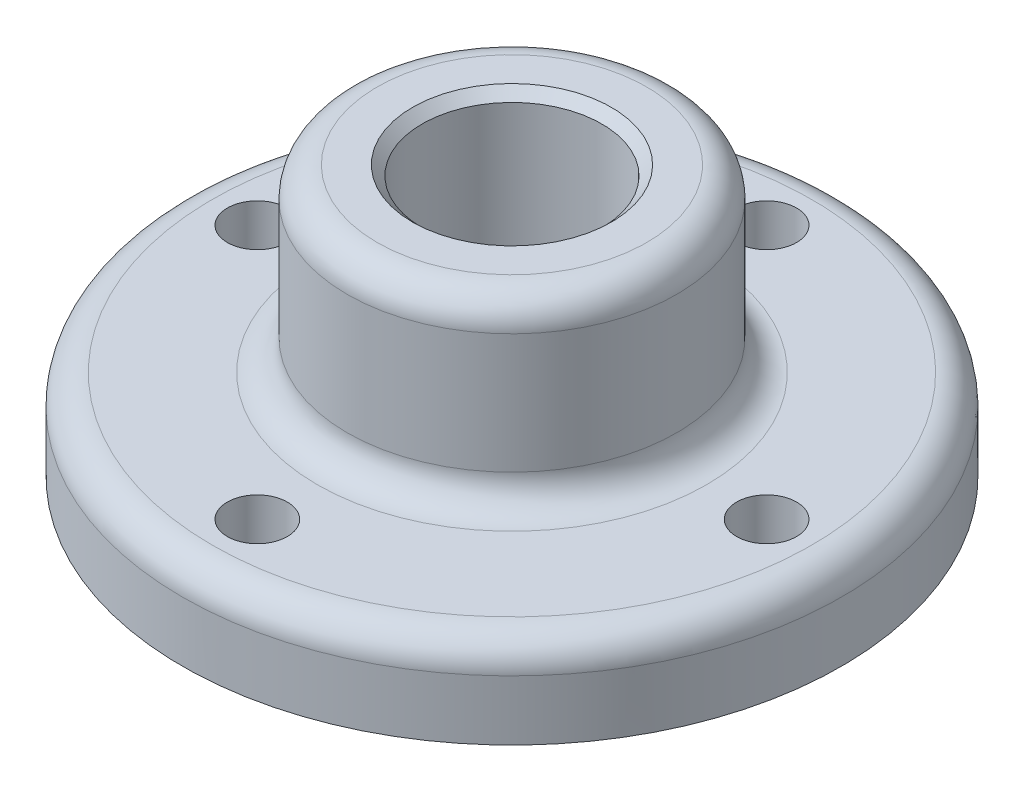
ISO-10303-21;
HEADER;
FILE_DESCRIPTION(('STEP AP214'),'2;1');
FILE_NAME('part.step','',(''),(''),'','','');
FILE_SCHEMA(('AUTOMOTIVE_DESIGN { 1 0 10303 214 1 1 1 1 }'));
ENDSEC;
DATA;
#1=APPLICATION_CONTEXT('core data for automotive mechanical design processes');
#2=APPLICATION_PROTOCOL_DEFINITION('international standard','automotive_design',2000,#1);
#3=PRODUCT_CONTEXT('',#1,'mechanical');
#4=PRODUCT('Part','Part','',(#3));
#5=PRODUCT_RELATED_PRODUCT_CATEGORY('part','',(#4));
#6=PRODUCT_DEFINITION_FORMATION('','',#4);
#7=PRODUCT_DEFINITION_CONTEXT('part definition',#1,'design');
#8=PRODUCT_DEFINITION('design','',#6,#7);
#9=PRODUCT_DEFINITION_SHAPE('','',#8);
#10=(LENGTH_UNIT() NAMED_UNIT(*) SI_UNIT(.MILLI.,.METRE.));
#11=(NAMED_UNIT(*) PLANE_ANGLE_UNIT() SI_UNIT($,.RADIAN.));
#12=(NAMED_UNIT(*) SI_UNIT($,.STERADIAN.) SOLID_ANGLE_UNIT());
#13=UNCERTAINTY_MEASURE_WITH_UNIT(LENGTH_MEASURE(1.E-05),#10,'distance_accuracy_value','');
#14=(GEOMETRIC_REPRESENTATION_CONTEXT(3) GLOBAL_UNCERTAINTY_ASSIGNED_CONTEXT((#13)) GLOBAL_UNIT_ASSIGNED_CONTEXT((#10,
#11,#12)) REPRESENTATION_CONTEXT('',''));
#15=CARTESIAN_POINT('',(0.,0.,0.));
#16=DIRECTION('',(0.,0.,1.));
#17=DIRECTION('',(1.,0.,0.));
#18=AXIS2_PLACEMENT_3D('',#15,#16,#17);
#19=CARTESIAN_POINT('',(0.,0.,0.));
#20=DIRECTION('',(0.,-1.,0.));
#21=DIRECTION('',(0.,0.,-1.));
#22=AXIS2_PLACEMENT_3D('',#19,#20,#21);
#23=PLANE('',#22);
#24=CARTESIAN_POINT('',(-53.9749999999985,0.,1.53406209396152E-12));
#25=DIRECTION('',(0.,-1.,0.));
#26=DIRECTION('',(0.,0.,-1.));
#27=AXIS2_PLACEMENT_3D('',#24,#25,#26);
#28=CIRCLE('',#27,6.35000000000245);
#29=CARTESIAN_POINT('',(-53.9749999999985,0.,6.35000000000399));
#30=VERTEX_POINT('',#29);
#31=EDGE_CURVE('E87',#30,#30,#28,.F.);
#32=ORIENTED_EDGE('',*,*,#31,.T.);
#33=EDGE_LOOP('',(#32));
#34=FACE_BOUND('',#33,.T.);
#35=CARTESIAN_POINT('',(3.05490412572624E-12,0.,53.975));
#36=DIRECTION('',(0.,-1.,0.));
#37=DIRECTION('',(0.,0.,-1.));
#38=AXIS2_PLACEMENT_3D('',#35,#36,#37);
#39=CIRCLE('',#38,6.35000000000328);
#40=CARTESIAN_POINT('',(3.05490412572624E-12,0.,60.3250000000033));
#41=VERTEX_POINT('',#40);
#42=EDGE_CURVE('E81',#41,#41,#39,.F.);
#43=ORIENTED_EDGE('',*,*,#42,.T.);
#44=EDGE_LOOP('',(#43));
#45=FACE_BOUND('',#44,.T.);
#46=CARTESIAN_POINT('',(53.9750000000015,0.,-1.52745206286312E-12));
#47=DIRECTION('',(0.,-1.,0.));
#48=DIRECTION('',(0.,0.,-1.));
#49=AXIS2_PLACEMENT_3D('',#46,#47,#48);
#50=CIRCLE('',#49,6.3500000000012);
#51=CARTESIAN_POINT('',(53.9750000000015,0.,6.34999999999967));
#52=VERTEX_POINT('',#51);
#53=EDGE_CURVE('E75',#52,#52,#50,.F.);
#54=ORIENTED_EDGE('',*,*,#53,.T.);
#55=EDGE_LOOP('',(#54));
#56=FACE_BOUND('',#55,.T.);
#57=CARTESIAN_POINT('',(0.,0.,-53.975));
#58=DIRECTION('',(0.,-1.,0.));
#59=DIRECTION('',(0.,0.,-1.));
#60=AXIS2_PLACEMENT_3D('',#57,#58,#59);
#61=CIRCLE('',#60,6.35);
#62=CARTESIAN_POINT('',(0.,0.,-47.625));
#63=VERTEX_POINT('',#62);
#64=EDGE_CURVE('E69',#63,#63,#61,.F.);
#65=ORIENTED_EDGE('',*,*,#64,.T.);
#66=EDGE_LOOP('',(#65));
#67=FACE_BOUND('',#66,.T.);
#68=CARTESIAN_POINT('',(0.,0.,0.));
#69=DIRECTION('',(0.,1.,0.));
#70=DIRECTION('',(0.,0.,1.));
#71=AXIS2_PLACEMENT_3D('',#68,#69,#70);
#72=CIRCLE('',#71,19.05);
#73=CARTESIAN_POINT('',(0.,0.,19.05));
#74=VERTEX_POINT('',#73);
#75=EDGE_CURVE('E66',#74,#74,#72,.T.);
#76=ORIENTED_EDGE('',*,*,#75,.T.);
#77=EDGE_LOOP('',(#76));
#78=FACE_BOUND('',#77,.T.);
#79=CARTESIAN_POINT('',(0.,0.,0.));
#80=DIRECTION('',(0.,-1.,0.));
#81=DIRECTION('',(0.,0.,-1.));
#82=AXIS2_PLACEMENT_3D('',#79,#80,#81);
#83=CIRCLE('',#82,69.85);
#84=CARTESIAN_POINT('',(0.,0.,-69.85));
#85=VERTEX_POINT('',#84);
#86=EDGE_CURVE('E63',#85,#85,#83,.T.);
#87=ORIENTED_EDGE('',*,*,#86,.T.);
#88=EDGE_LOOP('',(#87));
#89=FACE_BOUND('',#88,.T.);
#90=ADVANCED_FACE('F31',(#34,#45,#56,#67,#78,#89),#23,.T.);
#91=CARTESIAN_POINT('',(0.,0.,0.));
#92=DIRECTION('',(0.,-1.,0.));
#93=DIRECTION('',(0.,0.,-1.));
#94=AXIS2_PLACEMENT_3D('',#91,#92,#93);
#95=CYLINDRICAL_SURFACE('',#94,69.85);
#96=CARTESIAN_POINT('',(0.,12.7,0.));
#97=DIRECTION('',(0.,1.,0.));
#98=DIRECTION('',(0.,0.,1.));
#99=AXIS2_PLACEMENT_3D('',#96,#97,#98);
#100=CIRCLE('',#99,69.85);
#101=CARTESIAN_POINT('',(0.,12.7,69.85));
#102=VERTEX_POINT('',#101);
#103=EDGE_CURVE('E60',#102,#102,#100,.F.);
#104=ORIENTED_EDGE('',*,*,#103,.T.);
#105=EDGE_LOOP('',(#104));
#106=FACE_BOUND('',#105,.T.);
#107=ORIENTED_EDGE('',*,*,#86,.F.);
#108=EDGE_LOOP('',(#107));
#109=FACE_BOUND('',#108,.T.);
#110=ADVANCED_FACE('F101',(#106,#109),#95,.T.);
#111=CARTESIAN_POINT('',(69.85,19.05,0.));
#112=DIRECTION('',(0.,1.,0.));
#113=DIRECTION('',(0.,0.,1.));
#114=AXIS2_PLACEMENT_3D('',#111,#112,#113);
#115=PLANE('',#114);
#116=CARTESIAN_POINT('',(0.,19.05,0.));
#117=DIRECTION('',(0.,1.,0.));
#118=DIRECTION('',(0.,0.,1.));
#119=AXIS2_PLACEMENT_3D('',#116,#117,#118);
#120=CIRCLE('',#119,63.5);
#121=CARTESIAN_POINT('',(0.,19.05,63.5));
#122=VERTEX_POINT('',#121);
#123=EDGE_CURVE('E54',#122,#122,#120,.T.);
#124=ORIENTED_EDGE('',*,*,#123,.T.);
#125=EDGE_LOOP('',(#124));
#126=FACE_BOUND('',#125,.T.);
#127=CARTESIAN_POINT('',(0.,19.05,0.));
#128=DIRECTION('',(0.,1.,0.));
#129=DIRECTION('',(0.,0.,1.));
#130=AXIS2_PLACEMENT_3D('',#127,#128,#129);
#131=CIRCLE('',#130,41.275);
#132=CARTESIAN_POINT('',(0.,19.05,41.275));
#133=VERTEX_POINT('',#132);
#134=EDGE_CURVE('E57',#133,#133,#131,.F.);
#135=ORIENTED_EDGE('',*,*,#134,.T.);
#136=EDGE_LOOP('',(#135));
#137=FACE_BOUND('',#136,.T.);
#138=CARTESIAN_POINT('',(-53.9749999999985,19.05,1.53406209396152E-12));
#139=DIRECTION('',(0.,1.,0.));
#140=DIRECTION('',(0.,0.,1.));
#141=AXIS2_PLACEMENT_3D('',#138,#139,#140);
#142=CIRCLE('',#141,6.35000000000245);
#143=CARTESIAN_POINT('',(-53.9749999999985,19.05,6.35000000000399));
#144=VERTEX_POINT('',#143);
#145=EDGE_CURVE('E90',#144,#144,#142,.T.);
#146=ORIENTED_EDGE('',*,*,#145,.F.);
#147=EDGE_LOOP('',(#146));
#148=FACE_BOUND('',#147,.T.);
#149=CARTESIAN_POINT('',(3.05490412572624E-12,19.05,53.975));
#150=DIRECTION('',(0.,1.,0.));
#151=DIRECTION('',(0.,0.,1.));
#152=AXIS2_PLACEMENT_3D('',#149,#150,#151);
#153=CIRCLE('',#152,6.35000000000328);
#154=CARTESIAN_POINT('',(3.05490412572624E-12,19.05,60.3250000000033));
#155=VERTEX_POINT('',#154);
#156=EDGE_CURVE('E84',#155,#155,#153,.T.);
#157=ORIENTED_EDGE('',*,*,#156,.F.);
#158=EDGE_LOOP('',(#157));
#159=FACE_BOUND('',#158,.T.);
#160=CARTESIAN_POINT('',(53.9750000000015,19.05,-1.52745206286312E-12));
#161=DIRECTION('',(0.,1.,0.));
#162=DIRECTION('',(0.,0.,1.));
#163=AXIS2_PLACEMENT_3D('',#160,#161,#162);
#164=CIRCLE('',#163,6.3500000000012);
#165=CARTESIAN_POINT('',(53.9750000000015,19.05,6.34999999999967));
#166=VERTEX_POINT('',#165);
#167=EDGE_CURVE('E78',#166,#166,#164,.T.);
#168=ORIENTED_EDGE('',*,*,#167,.F.);
#169=EDGE_LOOP('',(#168));
#170=FACE_BOUND('',#169,.T.);
#171=CARTESIAN_POINT('',(0.,19.05,-53.975));
#172=DIRECTION('',(0.,1.,0.));
#173=DIRECTION('',(0.,0.,1.));
#174=AXIS2_PLACEMENT_3D('',#171,#172,#173);
#175=CIRCLE('',#174,6.35);
#176=CARTESIAN_POINT('',(0.,19.05,-47.625));
#177=VERTEX_POINT('',#176);
#178=EDGE_CURVE('E72',#177,#177,#175,.T.);
#179=ORIENTED_EDGE('',*,*,#178,.F.);
#180=EDGE_LOOP('',(#179));
#181=FACE_BOUND('',#180,.T.);
#182=ADVANCED_FACE('F97',(#126,#137,#148,#159,#170,#181),#115,.T.);
#183=CARTESIAN_POINT('',(0.,0.,0.));
#184=DIRECTION('',(0.,-1.,0.));
#185=DIRECTION('',(0.,0.,-1.));
#186=AXIS2_PLACEMENT_3D('',#183,#184,#185);
#187=CYLINDRICAL_SURFACE('',#186,34.925);
#188=CARTESIAN_POINT('',(0.,50.8,0.));
#189=DIRECTION('',(0.,1.,0.));
#190=DIRECTION('',(0.,0.,1.));
#191=AXIS2_PLACEMENT_3D('',#188,#189,#190);
#192=CIRCLE('',#191,34.925);
#193=CARTESIAN_POINT('',(0.,50.8,34.925));
#194=VERTEX_POINT('',#193);
#195=EDGE_CURVE('E46',#194,#194,#192,.F.);
#196=ORIENTED_EDGE('',*,*,#195,.T.);
#197=EDGE_LOOP('',(#196));
#198=FACE_BOUND('',#197,.T.);
#199=CARTESIAN_POINT('',(0.,25.4,0.));
#200=DIRECTION('',(0.,1.,0.));
#201=DIRECTION('',(0.,0.,1.));
#202=AXIS2_PLACEMENT_3D('',#199,#200,#201);
#203=CIRCLE('',#202,34.925);
#204=CARTESIAN_POINT('',(0.,25.4,34.925));
#205=VERTEX_POINT('',#204);
#206=EDGE_CURVE('E51',#205,#205,#203,.T.);
#207=ORIENTED_EDGE('',*,*,#206,.T.);
#208=EDGE_LOOP('',(#207));
#209=FACE_BOUND('',#208,.T.);
#210=ADVANCED_FACE('F100',(#198,#209),#187,.T.);
#211=CARTESIAN_POINT('',(34.925,57.15,0.));
#212=DIRECTION('',(0.,1.,0.));
#213=DIRECTION('',(0.,0.,1.));
#214=AXIS2_PLACEMENT_3D('',#211,#212,#213);
#215=PLANE('',#214);
#216=CARTESIAN_POINT('',(0.,57.15,0.));
#217=DIRECTION('',(0.,1.,0.));
#218=DIRECTION('',(0.,0.,1.));
#219=AXIS2_PLACEMENT_3D('',#216,#217,#218);
#220=CIRCLE('',#219,21.082);
#221=CARTESIAN_POINT('',(0.,57.15,21.082));
#222=VERTEX_POINT('',#221);
#223=EDGE_CURVE('E10',#222,#222,#220,.F.);
#224=ORIENTED_EDGE('',*,*,#223,.T.);
#225=EDGE_LOOP('',(#224));
#226=FACE_BOUND('',#225,.T.);
#227=CARTESIAN_POINT('',(0.,57.15,0.));
#228=DIRECTION('',(0.,1.,0.));
#229=DIRECTION('',(0.,0.,1.));
#230=AXIS2_PLACEMENT_3D('',#227,#228,#229);
#231=CIRCLE('',#230,28.575);
#232=CARTESIAN_POINT('',(0.,57.15,28.575));
#233=VERTEX_POINT('',#232);
#234=EDGE_CURVE('E42',#233,#233,#231,.T.);
#235=ORIENTED_EDGE('',*,*,#234,.T.);
#236=EDGE_LOOP('',(#235));
#237=FACE_BOUND('',#236,.T.);
#238=ADVANCED_FACE('F153',(#226,#237),#215,.T.);
#239=CARTESIAN_POINT('',(0.,0.,0.));
#240=DIRECTION('',(0.,1.,0.));
#241=DIRECTION('',(0.,0.,1.));
#242=AXIS2_PLACEMENT_3D('',#239,#240,#241);
#243=CYLINDRICAL_SURFACE('',#242,19.05);
#244=CARTESIAN_POINT('',(0.,55.118,0.));
#245=DIRECTION('',(0.,1.,0.));
#246=DIRECTION('',(0.,0.,1.));
#247=AXIS2_PLACEMENT_3D('',#244,#245,#246);
#248=CIRCLE('',#247,19.05);
#249=CARTESIAN_POINT('',(0.,55.118,19.05));
#250=VERTEX_POINT('',#249);
#251=EDGE_CURVE('E38',#250,#250,#248,.T.);
#252=ORIENTED_EDGE('',*,*,#251,.T.);
#253=EDGE_LOOP('',(#252));
#254=FACE_BOUND('',#253,.T.);
#255=ORIENTED_EDGE('',*,*,#75,.F.);
#256=EDGE_LOOP('',(#255));
#257=FACE_BOUND('',#256,.T.);
#258=ADVANCED_FACE('F114',(#254,#257),#243,.F.);
#259=CARTESIAN_POINT('',(0.,-17.9605122421476,-53.975));
#260=DIRECTION('',(0.,1.,0.));
#261=DIRECTION('',(0.,0.,1.));
#262=AXIS2_PLACEMENT_3D('',#259,#260,#261);
#263=CYLINDRICAL_SURFACE('',#262,6.35);
#264=CARTESIAN_POINT('',(0.,19.05,-47.625));
#265=CARTESIAN_POINT('',(0.,18.8515625,-47.625));
#266=CARTESIAN_POINT('',(0.,18.653125,-47.625));
#267=CARTESIAN_POINT('',(0.,18.25625,-47.625));
#268=CARTESIAN_POINT('',(0.,18.0578125,-47.625));
#269=CARTESIAN_POINT('',(0.,17.6609375,-47.625));
#270=CARTESIAN_POINT('',(0.,17.4625,-47.625));
#271=CARTESIAN_POINT('',(0.,17.065625,-47.625));
#272=CARTESIAN_POINT('',(0.,16.8671875,-47.625));
#273=CARTESIAN_POINT('',(0.,16.4703125,-47.625));
#274=CARTESIAN_POINT('',(0.,16.271875,-47.625));
#275=CARTESIAN_POINT('',(0.,15.875,-47.625));
#276=CARTESIAN_POINT('',(0.,15.6765625,-47.625));
#277=CARTESIAN_POINT('',(0.,15.2796875,-47.625));
#278=CARTESIAN_POINT('',(0.,15.08125,-47.625));
#279=CARTESIAN_POINT('',(0.,14.684375,-47.625));
#280=CARTESIAN_POINT('',(0.,14.4859375,-47.625));
#281=CARTESIAN_POINT('',(0.,14.0890625,-47.625));
#282=CARTESIAN_POINT('',(0.,13.890625,-47.625));
#283=CARTESIAN_POINT('',(0.,13.49375,-47.625));
#284=CARTESIAN_POINT('',(0.,13.2953125,-47.625));
#285=CARTESIAN_POINT('',(0.,12.8984375,-47.625));
#286=CARTESIAN_POINT('',(0.,12.7,-47.625));
#287=CARTESIAN_POINT('',(0.,12.303125,-47.625));
#288=CARTESIAN_POINT('',(0.,12.1046875,-47.625));
#289=CARTESIAN_POINT('',(0.,11.7078125,-47.625));
#290=CARTESIAN_POINT('',(0.,11.509375,-47.625));
#291=CARTESIAN_POINT('',(0.,11.1125,-47.625));
#292=CARTESIAN_POINT('',(0.,10.9140625,-47.625));
#293=CARTESIAN_POINT('',(0.,10.5171875,-47.625));
#294=CARTESIAN_POINT('',(0.,10.31875,-47.625));
#295=CARTESIAN_POINT('',(0.,9.921875,-47.625));
#296=CARTESIAN_POINT('',(0.,9.7234375,-47.625));
#297=CARTESIAN_POINT('',(0.,9.3265625,-47.625));
#298=CARTESIAN_POINT('',(0.,9.128125,-47.625));
#299=CARTESIAN_POINT('',(0.,8.73125,-47.625));
#300=CARTESIAN_POINT('',(0.,8.5328125,-47.625));
#301=CARTESIAN_POINT('',(0.,8.1359375,-47.625));
#302=CARTESIAN_POINT('',(0.,7.9375,-47.625));
#303=CARTESIAN_POINT('',(0.,7.540625,-47.625));
#304=CARTESIAN_POINT('',(0.,7.3421875,-47.625));
#305=CARTESIAN_POINT('',(0.,6.9453125,-47.625));
#306=CARTESIAN_POINT('',(0.,6.746875,-47.625));
#307=CARTESIAN_POINT('',(0.,6.35,-47.625));
#308=CARTESIAN_POINT('',(0.,6.1515625,-47.625));
#309=CARTESIAN_POINT('',(0.,5.7546875,-47.625));
#310=CARTESIAN_POINT('',(0.,5.55625,-47.625));
#311=CARTESIAN_POINT('',(0.,5.159375,-47.625));
#312=CARTESIAN_POINT('',(0.,4.9609375,-47.625));
#313=CARTESIAN_POINT('',(0.,4.5640625,-47.625));
#314=CARTESIAN_POINT('',(0.,4.365625,-47.625));
#315=CARTESIAN_POINT('',(0.,3.96875,-47.625));
#316=CARTESIAN_POINT('',(0.,3.7703125,-47.625));
#317=CARTESIAN_POINT('',(0.,3.3734375,-47.625));
#318=CARTESIAN_POINT('',(0.,3.175,-47.625));
#319=CARTESIAN_POINT('',(0.,2.778125,-47.625));
#320=CARTESIAN_POINT('',(0.,2.5796875,-47.625));
#321=CARTESIAN_POINT('',(0.,2.1828125,-47.625));
#322=CARTESIAN_POINT('',(0.,1.984375,-47.625));
#323=CARTESIAN_POINT('',(0.,1.5875,-47.625));
#324=CARTESIAN_POINT('',(0.,1.3890625,-47.625));
#325=CARTESIAN_POINT('',(0.,0.992187500000004,-47.625));
#326=CARTESIAN_POINT('',(0.,0.793750000000004,-47.625));
#327=CARTESIAN_POINT('',(0.,0.396875000000004,-47.625));
#328=CARTESIAN_POINT('',(0.,0.198437500000004,-47.625));
#329=CARTESIAN_POINT('',(0.,0.,-47.625));
#330=B_SPLINE_CURVE_WITH_KNOTS('',3,(#264,#265,#266,#267,#268,#269,#270,#271,#272,#273,#274,
#275,#276,#277,#278,#279,#280,#281,#282,#283,#284,#285,#286,#287,#288,#289,#290,#291,#292,#293,
#294,#295,#296,#297,#298,#299,#300,#301,#302,#303,#304,#305,#306,#307,#308,#309,#310,#311,#312,
#313,#314,#315,#316,#317,#318,#319,#320,#321,#322,#323,#324,#325,#326,#327,#328,#329),
.UNSPECIFIED.,.F.,.F.,(4,2,2,2,2,2,2,2,2,2,2,2,2,2,2,2,2,2,2,2,2,2,2,2,2,2,2,2,2,2,2,2,4),(0.,
0.5953125,1.190625,1.7859375,2.38125,2.9765625,3.571875,4.1671875,4.7625,5.3578125,
5.95312499999999,6.54843749999999,7.14374999999999,7.73906249999999,8.33437499999999,
8.92968749999999,9.52499999999999,10.1203125,10.715625,11.3109375,11.90625,12.5015625,13.096875,
13.6921875,14.2875,14.8828125,15.478125,16.0734375,16.66875,17.2640625,17.859375,18.4546875,
19.05),.UNSPECIFIED.);
#331=EDGE_CURVE('BSEAM110',#177,#63,#330,.T.);
#332=ORIENTED_EDGE('',*,*,#178,.T.);
#333=ORIENTED_EDGE('',*,*,#64,.F.);
#334=ORIENTED_EDGE('',*,*,#331,.T.);
#335=ORIENTED_EDGE('',*,*,#331,.F.);
#336=EDGE_LOOP('',(#332,#334,#333,#335));
#337=FACE_BOUND('',#336,.T.);
#338=ADVANCED_FACE('F110',(#337),#263,.F.);
#339=CARTESIAN_POINT('',(53.9750000000015,-17.9605122421476,-1.52745206286312E-12));
#340=DIRECTION('',(0.,1.,0.));
#341=DIRECTION('',(0.,0.,1.));
#342=AXIS2_PLACEMENT_3D('',#339,#340,#341);
#343=CYLINDRICAL_SURFACE('',#342,6.3500000000012);
#344=CARTESIAN_POINT('',(53.9750000000015,19.05,6.34999999999967));
#345=CARTESIAN_POINT('',(53.9750000000015,18.8515625,6.34999999999967));
#346=CARTESIAN_POINT('',(53.9750000000015,18.653125,6.34999999999967));
#347=CARTESIAN_POINT('',(53.9750000000015,18.25625,6.34999999999967));
#348=CARTESIAN_POINT('',(53.9750000000015,18.0578125,6.34999999999967));
#349=CARTESIAN_POINT('',(53.9750000000015,17.6609375,6.34999999999967));
#350=CARTESIAN_POINT('',(53.9750000000015,17.4625,6.34999999999967));
#351=CARTESIAN_POINT('',(53.9750000000015,17.065625,6.34999999999967));
#352=CARTESIAN_POINT('',(53.9750000000015,16.8671875,6.34999999999967));
#353=CARTESIAN_POINT('',(53.9750000000015,16.4703125,6.34999999999967));
#354=CARTESIAN_POINT('',(53.9750000000015,16.271875,6.34999999999967));
#355=CARTESIAN_POINT('',(53.9750000000015,15.875,6.34999999999967));
#356=CARTESIAN_POINT('',(53.9750000000015,15.6765625,6.34999999999967));
#357=CARTESIAN_POINT('',(53.9750000000015,15.2796875,6.34999999999967));
#358=CARTESIAN_POINT('',(53.9750000000015,15.08125,6.34999999999967));
#359=CARTESIAN_POINT('',(53.9750000000015,14.684375,6.34999999999967));
#360=CARTESIAN_POINT('',(53.9750000000015,14.4859375,6.34999999999967));
#361=CARTESIAN_POINT('',(53.9750000000015,14.0890625,6.34999999999967));
#362=CARTESIAN_POINT('',(53.9750000000015,13.890625,6.34999999999967));
#363=CARTESIAN_POINT('',(53.9750000000015,13.49375,6.34999999999967));
#364=CARTESIAN_POINT('',(53.9750000000015,13.2953125,6.34999999999967));
#365=CARTESIAN_POINT('',(53.9750000000015,12.8984375,6.34999999999967));
#366=CARTESIAN_POINT('',(53.9750000000015,12.7,6.34999999999967));
#367=CARTESIAN_POINT('',(53.9750000000015,12.303125,6.34999999999967));
#368=CARTESIAN_POINT('',(53.9750000000015,12.1046875,6.34999999999967));
#369=CARTESIAN_POINT('',(53.9750000000015,11.7078125,6.34999999999967));
#370=CARTESIAN_POINT('',(53.9750000000015,11.509375,6.34999999999967));
#371=CARTESIAN_POINT('',(53.9750000000015,11.1125,6.34999999999967));
#372=CARTESIAN_POINT('',(53.9750000000015,10.9140625,6.34999999999967));
#373=CARTESIAN_POINT('',(53.9750000000015,10.5171875,6.34999999999967));
#374=CARTESIAN_POINT('',(53.9750000000015,10.31875,6.34999999999967));
#375=CARTESIAN_POINT('',(53.9750000000015,9.921875,6.34999999999967));
#376=CARTESIAN_POINT('',(53.9750000000015,9.7234375,6.34999999999967));
#377=CARTESIAN_POINT('',(53.9750000000015,9.3265625,6.34999999999967));
#378=CARTESIAN_POINT('',(53.9750000000015,9.128125,6.34999999999967));
#379=CARTESIAN_POINT('',(53.9750000000015,8.73125,6.34999999999967));
#380=CARTESIAN_POINT('',(53.9750000000015,8.5328125,6.34999999999967));
#381=CARTESIAN_POINT('',(53.9750000000015,8.1359375,6.34999999999967));
#382=CARTESIAN_POINT('',(53.9750000000015,7.9375,6.34999999999967));
#383=CARTESIAN_POINT('',(53.9750000000015,7.540625,6.34999999999967));
#384=CARTESIAN_POINT('',(53.9750000000015,7.3421875,6.34999999999967));
#385=CARTESIAN_POINT('',(53.9750000000015,6.9453125,6.34999999999967));
#386=CARTESIAN_POINT('',(53.9750000000015,6.746875,6.34999999999967));
#387=CARTESIAN_POINT('',(53.9750000000015,6.35,6.34999999999967));
#388=CARTESIAN_POINT('',(53.9750000000015,6.1515625,6.34999999999967));
#389=CARTESIAN_POINT('',(53.9750000000015,5.7546875,6.34999999999967));
#390=CARTESIAN_POINT('',(53.9750000000015,5.55625,6.34999999999967));
#391=CARTESIAN_POINT('',(53.9750000000015,5.159375,6.34999999999967));
#392=CARTESIAN_POINT('',(53.9750000000015,4.9609375,6.34999999999967));
#393=CARTESIAN_POINT('',(53.9750000000015,4.5640625,6.34999999999967));
#394=CARTESIAN_POINT('',(53.9750000000015,4.365625,6.34999999999967));
#395=CARTESIAN_POINT('',(53.9750000000015,3.96875,6.34999999999967));
#396=CARTESIAN_POINT('',(53.9750000000015,3.7703125,6.34999999999967));
#397=CARTESIAN_POINT('',(53.9750000000015,3.3734375,6.34999999999967));
#398=CARTESIAN_POINT('',(53.9750000000015,3.175,6.34999999999967));
#399=CARTESIAN_POINT('',(53.9750000000015,2.778125,6.34999999999967));
#400=CARTESIAN_POINT('',(53.9750000000015,2.5796875,6.34999999999967));
#401=CARTESIAN_POINT('',(53.9750000000015,2.1828125,6.34999999999967));
#402=CARTESIAN_POINT('',(53.9750000000015,1.984375,6.34999999999967));
#403=CARTESIAN_POINT('',(53.9750000000015,1.5875,6.34999999999967));
#404=CARTESIAN_POINT('',(53.9750000000015,1.3890625,6.34999999999967));
#405=CARTESIAN_POINT('',(53.9750000000015,0.992187500000004,6.34999999999967));
#406=CARTESIAN_POINT('',(53.9750000000015,0.793750000000004,6.34999999999967));
#407=CARTESIAN_POINT('',(53.9750000000015,0.396875000000004,6.34999999999967));
#408=CARTESIAN_POINT('',(53.9750000000015,0.198437500000004,6.34999999999967));
#409=CARTESIAN_POINT('',(53.9750000000015,0.,6.34999999999967));
#410=B_SPLINE_CURVE_WITH_KNOTS('',3,(#344,#345,#346,#347,#348,#349,#350,#351,#352,#353,#354,
#355,#356,#357,#358,#359,#360,#361,#362,#363,#364,#365,#366,#367,#368,#369,#370,#371,#372,#373,
#374,#375,#376,#377,#378,#379,#380,#381,#382,#383,#384,#385,#386,#387,#388,#389,#390,#391,#392,
#393,#394,#395,#396,#397,#398,#399,#400,#401,#402,#403,#404,#405,#406,#407,#408,#409),
.UNSPECIFIED.,.F.,.F.,(4,2,2,2,2,2,2,2,2,2,2,2,2,2,2,2,2,2,2,2,2,2,2,2,2,2,2,2,2,2,2,2,4),(0.,
0.5953125,1.190625,1.7859375,2.38125,2.9765625,3.571875,4.1671875,4.7625,5.3578125,
5.95312499999999,6.54843749999999,7.14374999999999,7.73906249999999,8.33437499999999,
8.92968749999999,9.52499999999999,10.1203125,10.715625,11.3109375,11.90625,12.5015625,13.096875,
13.6921875,14.2875,14.8828125,15.478125,16.0734375,16.66875,17.2640625,17.859375,18.4546875,
19.05),.UNSPECIFIED.);
#411=EDGE_CURVE('BSEAM113',#166,#52,#410,.T.);
#412=ORIENTED_EDGE('',*,*,#167,.T.);
#413=ORIENTED_EDGE('',*,*,#53,.F.);
#414=ORIENTED_EDGE('',*,*,#411,.T.);
#415=ORIENTED_EDGE('',*,*,#411,.F.);
#416=EDGE_LOOP('',(#412,#414,#413,#415));
#417=FACE_BOUND('',#416,.T.);
#418=ADVANCED_FACE('F113',(#417),#343,.F.);
#419=CARTESIAN_POINT('',(3.05490412572624E-12,-17.9605122421476,53.975));
#420=DIRECTION('',(0.,1.,0.));
#421=DIRECTION('',(0.,0.,1.));
#422=AXIS2_PLACEMENT_3D('',#419,#420,#421);
#423=CYLINDRICAL_SURFACE('',#422,6.35000000000328);
#424=CARTESIAN_POINT('',(3.05490412572624E-12,19.05,60.3250000000033));
#425=CARTESIAN_POINT('',(3.05490412572624E-12,18.8515625,60.3250000000033));
#426=CARTESIAN_POINT('',(3.05490412572624E-12,18.653125,60.3250000000033));
#427=CARTESIAN_POINT('',(3.05490412572624E-12,18.25625,60.3250000000033));
#428=CARTESIAN_POINT('',(3.05490412572624E-12,18.0578125,60.3250000000033));
#429=CARTESIAN_POINT('',(3.05490412572624E-12,17.6609375,60.3250000000033));
#430=CARTESIAN_POINT('',(3.05490412572624E-12,17.4625,60.3250000000033));
#431=CARTESIAN_POINT('',(3.05490412572624E-12,17.065625,60.3250000000033));
#432=CARTESIAN_POINT('',(3.05490412572624E-12,16.8671875,60.3250000000033));
#433=CARTESIAN_POINT('',(3.05490412572624E-12,16.4703125,60.3250000000033));
#434=CARTESIAN_POINT('',(3.05490412572624E-12,16.271875,60.3250000000033));
#435=CARTESIAN_POINT('',(3.05490412572624E-12,15.875,60.3250000000033));
#436=CARTESIAN_POINT('',(3.05490412572624E-12,15.6765625,60.3250000000033));
#437=CARTESIAN_POINT('',(3.05490412572624E-12,15.2796875,60.3250000000033));
#438=CARTESIAN_POINT('',(3.05490412572624E-12,15.08125,60.3250000000033));
#439=CARTESIAN_POINT('',(3.05490412572624E-12,14.684375,60.3250000000033));
#440=CARTESIAN_POINT('',(3.05490412572624E-12,14.4859375,60.3250000000033));
#441=CARTESIAN_POINT('',(3.05490412572624E-12,14.0890625,60.3250000000033));
#442=CARTESIAN_POINT('',(3.05490412572624E-12,13.890625,60.3250000000033));
#443=CARTESIAN_POINT('',(3.05490412572624E-12,13.49375,60.3250000000033));
#444=CARTESIAN_POINT('',(3.05490412572624E-12,13.2953125,60.3250000000033));
#445=CARTESIAN_POINT('',(3.05490412572624E-12,12.8984375,60.3250000000033));
#446=CARTESIAN_POINT('',(3.05490412572624E-12,12.7,60.3250000000033));
#447=CARTESIAN_POINT('',(3.05490412572624E-12,12.303125,60.3250000000033));
#448=CARTESIAN_POINT('',(3.05490412572624E-12,12.1046875,60.3250000000033));
#449=CARTESIAN_POINT('',(3.05490412572624E-12,11.7078125,60.3250000000033));
#450=CARTESIAN_POINT('',(3.05490412572624E-12,11.509375,60.3250000000033));
#451=CARTESIAN_POINT('',(3.05490412572624E-12,11.1125,60.3250000000033));
#452=CARTESIAN_POINT('',(3.05490412572624E-12,10.9140625,60.3250000000033));
#453=CARTESIAN_POINT('',(3.05490412572624E-12,10.5171875,60.3250000000033));
#454=CARTESIAN_POINT('',(3.05490412572624E-12,10.31875,60.3250000000033));
#455=CARTESIAN_POINT('',(3.05490412572624E-12,9.921875,60.3250000000033));
#456=CARTESIAN_POINT('',(3.05490412572624E-12,9.7234375,60.3250000000033));
#457=CARTESIAN_POINT('',(3.05490412572624E-12,9.3265625,60.3250000000033));
#458=CARTESIAN_POINT('',(3.05490412572624E-12,9.128125,60.3250000000033));
#459=CARTESIAN_POINT('',(3.05490412572624E-12,8.73125,60.3250000000033));
#460=CARTESIAN_POINT('',(3.05490412572624E-12,8.5328125,60.3250000000033));
#461=CARTESIAN_POINT('',(3.05490412572624E-12,8.1359375,60.3250000000033));
#462=CARTESIAN_POINT('',(3.05490412572624E-12,7.9375,60.3250000000033));
#463=CARTESIAN_POINT('',(3.05490412572624E-12,7.540625,60.3250000000033));
#464=CARTESIAN_POINT('',(3.05490412572624E-12,7.3421875,60.3250000000033));
#465=CARTESIAN_POINT('',(3.05490412572624E-12,6.9453125,60.3250000000033));
#466=CARTESIAN_POINT('',(3.05490412572624E-12,6.746875,60.3250000000033));
#467=CARTESIAN_POINT('',(3.05490412572624E-12,6.35,60.3250000000033));
#468=CARTESIAN_POINT('',(3.05490412572624E-12,6.1515625,60.3250000000033));
#469=CARTESIAN_POINT('',(3.05490412572624E-12,5.7546875,60.3250000000033));
#470=CARTESIAN_POINT('',(3.05490412572624E-12,5.55625,60.3250000000033));
#471=CARTESIAN_POINT('',(3.05490412572624E-12,5.159375,60.3250000000033));
#472=CARTESIAN_POINT('',(3.05490412572624E-12,4.9609375,60.3250000000033));
#473=CARTESIAN_POINT('',(3.05490412572624E-12,4.5640625,60.3250000000033));
#474=CARTESIAN_POINT('',(3.05490412572624E-12,4.365625,60.3250000000033));
#475=CARTESIAN_POINT('',(3.05490412572624E-12,3.96875,60.3250000000033));
#476=CARTESIAN_POINT('',(3.05490412572624E-12,3.7703125,60.3250000000033));
#477=CARTESIAN_POINT('',(3.05490412572624E-12,3.3734375,60.3250000000033));
#478=CARTESIAN_POINT('',(3.05490412572624E-12,3.175,60.3250000000033));
#479=CARTESIAN_POINT('',(3.05490412572624E-12,2.778125,60.3250000000033));
#480=CARTESIAN_POINT('',(3.05490412572624E-12,2.5796875,60.3250000000033));
#481=CARTESIAN_POINT('',(3.05490412572624E-12,2.1828125,60.3250000000033));
#482=CARTESIAN_POINT('',(3.05490412572624E-12,1.984375,60.3250000000033));
#483=CARTESIAN_POINT('',(3.05490412572624E-12,1.5875,60.3250000000033));
#484=CARTESIAN_POINT('',(3.05490412572624E-12,1.3890625,60.3250000000033));
#485=CARTESIAN_POINT('',(3.05490412572624E-12,0.992187500000004,60.3250000000033));
#486=CARTESIAN_POINT('',(3.05490412572624E-12,0.793750000000004,60.3250000000033));
#487=CARTESIAN_POINT('',(3.05490412572624E-12,0.396875000000004,60.3250000000033));
#488=CARTESIAN_POINT('',(3.05490412572624E-12,0.198437500000004,60.3250000000033));
#489=CARTESIAN_POINT('',(3.05490412572624E-12,0.,60.3250000000033));
#490=B_SPLINE_CURVE_WITH_KNOTS('',3,(#424,#425,#426,#427,#428,#429,#430,#431,#432,#433,#434,
#435,#436,#437,#438,#439,#440,#441,#442,#443,#444,#445,#446,#447,#448,#449,#450,#451,#452,#453,
#454,#455,#456,#457,#458,#459,#460,#461,#462,#463,#464,#465,#466,#467,#468,#469,#470,#471,#472,
#473,#474,#475,#476,#477,#478,#479,#480,#481,#482,#483,#484,#485,#486,#487,#488,#489),
.UNSPECIFIED.,.F.,.F.,(4,2,2,2,2,2,2,2,2,2,2,2,2,2,2,2,2,2,2,2,2,2,2,2,2,2,2,2,2,2,2,2,4),(0.,
0.5953125,1.190625,1.7859375,2.38125,2.9765625,3.571875,4.1671875,4.7625,5.3578125,
5.95312499999999,6.54843749999999,7.14374999999999,7.73906249999999,8.33437499999999,
8.92968749999999,9.52499999999999,10.1203125,10.715625,11.3109375,11.90625,12.5015625,13.096875,
13.6921875,14.2875,14.8828125,15.478125,16.0734375,16.66875,17.2640625,17.859375,18.4546875,
19.05),.UNSPECIFIED.);
#491=EDGE_CURVE('BSEAM164',#155,#41,#490,.T.);
#492=ORIENTED_EDGE('',*,*,#156,.T.);
#493=ORIENTED_EDGE('',*,*,#42,.F.);
#494=ORIENTED_EDGE('',*,*,#491,.T.);
#495=ORIENTED_EDGE('',*,*,#491,.F.);
#496=EDGE_LOOP('',(#492,#494,#493,#495));
#497=FACE_BOUND('',#496,.T.);
#498=ADVANCED_FACE('F164',(#497),#423,.F.);
#499=CARTESIAN_POINT('',(-53.9749999999985,-17.9605122421476,1.53406209396152E-12));
#500=DIRECTION('',(0.,1.,0.));
#501=DIRECTION('',(0.,0.,1.));
#502=AXIS2_PLACEMENT_3D('',#499,#500,#501);
#503=CYLINDRICAL_SURFACE('',#502,6.35000000000245);
#504=CARTESIAN_POINT('',(-53.9749999999985,19.05,6.35000000000399));
#505=CARTESIAN_POINT('',(-53.9749999999985,18.8515625,6.35000000000399));
#506=CARTESIAN_POINT('',(-53.9749999999985,18.653125,6.35000000000399));
#507=CARTESIAN_POINT('',(-53.9749999999985,18.25625,6.35000000000399));
#508=CARTESIAN_POINT('',(-53.9749999999985,18.0578125,6.35000000000399));
#509=CARTESIAN_POINT('',(-53.9749999999985,17.6609375,6.35000000000399));
#510=CARTESIAN_POINT('',(-53.9749999999985,17.4625,6.35000000000399));
#511=CARTESIAN_POINT('',(-53.9749999999985,17.065625,6.35000000000399));
#512=CARTESIAN_POINT('',(-53.9749999999985,16.8671875,6.35000000000399));
#513=CARTESIAN_POINT('',(-53.9749999999985,16.4703125,6.35000000000399));
#514=CARTESIAN_POINT('',(-53.9749999999985,16.271875,6.35000000000399));
#515=CARTESIAN_POINT('',(-53.9749999999985,15.875,6.35000000000399));
#516=CARTESIAN_POINT('',(-53.9749999999985,15.6765625,6.35000000000399));
#517=CARTESIAN_POINT('',(-53.9749999999985,15.2796875,6.35000000000399));
#518=CARTESIAN_POINT('',(-53.9749999999985,15.08125,6.35000000000399));
#519=CARTESIAN_POINT('',(-53.9749999999985,14.684375,6.35000000000399));
#520=CARTESIAN_POINT('',(-53.9749999999985,14.4859375,6.35000000000399));
#521=CARTESIAN_POINT('',(-53.9749999999985,14.0890625,6.35000000000399));
#522=CARTESIAN_POINT('',(-53.9749999999985,13.890625,6.35000000000399));
#523=CARTESIAN_POINT('',(-53.9749999999985,13.49375,6.35000000000399));
#524=CARTESIAN_POINT('',(-53.9749999999985,13.2953125,6.35000000000399));
#525=CARTESIAN_POINT('',(-53.9749999999985,12.8984375,6.35000000000399));
#526=CARTESIAN_POINT('',(-53.9749999999985,12.7,6.35000000000399));
#527=CARTESIAN_POINT('',(-53.9749999999985,12.303125,6.35000000000399));
#528=CARTESIAN_POINT('',(-53.9749999999985,12.1046875,6.35000000000399));
#529=CARTESIAN_POINT('',(-53.9749999999985,11.7078125,6.35000000000399));
#530=CARTESIAN_POINT('',(-53.9749999999985,11.509375,6.35000000000399));
#531=CARTESIAN_POINT('',(-53.9749999999985,11.1125,6.35000000000399));
#532=CARTESIAN_POINT('',(-53.9749999999985,10.9140625,6.35000000000399));
#533=CARTESIAN_POINT('',(-53.9749999999985,10.5171875,6.35000000000399));
#534=CARTESIAN_POINT('',(-53.9749999999985,10.31875,6.35000000000399));
#535=CARTESIAN_POINT('',(-53.9749999999985,9.921875,6.35000000000399));
#536=CARTESIAN_POINT('',(-53.9749999999985,9.7234375,6.35000000000399));
#537=CARTESIAN_POINT('',(-53.9749999999985,9.3265625,6.35000000000399));
#538=CARTESIAN_POINT('',(-53.9749999999985,9.128125,6.35000000000399));
#539=CARTESIAN_POINT('',(-53.9749999999985,8.73125,6.35000000000399));
#540=CARTESIAN_POINT('',(-53.9749999999985,8.5328125,6.35000000000399));
#541=CARTESIAN_POINT('',(-53.9749999999985,8.1359375,6.35000000000399));
#542=CARTESIAN_POINT('',(-53.9749999999985,7.9375,6.35000000000399));
#543=CARTESIAN_POINT('',(-53.9749999999985,7.540625,6.35000000000399));
#544=CARTESIAN_POINT('',(-53.9749999999985,7.3421875,6.35000000000399));
#545=CARTESIAN_POINT('',(-53.9749999999985,6.9453125,6.35000000000399));
#546=CARTESIAN_POINT('',(-53.9749999999985,6.746875,6.35000000000399));
#547=CARTESIAN_POINT('',(-53.9749999999985,6.35,6.35000000000399));
#548=CARTESIAN_POINT('',(-53.9749999999985,6.1515625,6.35000000000399));
#549=CARTESIAN_POINT('',(-53.9749999999985,5.7546875,6.35000000000399));
#550=CARTESIAN_POINT('',(-53.9749999999985,5.55625,6.35000000000399));
#551=CARTESIAN_POINT('',(-53.9749999999985,5.159375,6.35000000000399));
#552=CARTESIAN_POINT('',(-53.9749999999985,4.9609375,6.35000000000399));
#553=CARTESIAN_POINT('',(-53.9749999999985,4.5640625,6.35000000000399));
#554=CARTESIAN_POINT('',(-53.9749999999985,4.365625,6.35000000000399));
#555=CARTESIAN_POINT('',(-53.9749999999985,3.96875,6.35000000000399));
#556=CARTESIAN_POINT('',(-53.9749999999985,3.7703125,6.35000000000399));
#557=CARTESIAN_POINT('',(-53.9749999999985,3.3734375,6.35000000000399));
#558=CARTESIAN_POINT('',(-53.9749999999985,3.175,6.35000000000399));
#559=CARTESIAN_POINT('',(-53.9749999999985,2.778125,6.35000000000399));
#560=CARTESIAN_POINT('',(-53.9749999999985,2.5796875,6.35000000000399));
#561=CARTESIAN_POINT('',(-53.9749999999985,2.1828125,6.35000000000399));
#562=CARTESIAN_POINT('',(-53.9749999999985,1.984375,6.35000000000399));
#563=CARTESIAN_POINT('',(-53.9749999999985,1.5875,6.35000000000399));
#564=CARTESIAN_POINT('',(-53.9749999999985,1.3890625,6.35000000000399));
#565=CARTESIAN_POINT('',(-53.9749999999985,0.992187500000004,6.35000000000399));
#566=CARTESIAN_POINT('',(-53.9749999999985,0.793750000000004,6.35000000000399));
#567=CARTESIAN_POINT('',(-53.9749999999985,0.396875000000004,6.35000000000399));
#568=CARTESIAN_POINT('',(-53.9749999999985,0.198437500000004,6.35000000000399));
#569=CARTESIAN_POINT('',(-53.9749999999985,0.,6.35000000000399));
#570=B_SPLINE_CURVE_WITH_KNOTS('',3,(#504,#505,#506,#507,#508,#509,#510,#511,#512,#513,#514,
#515,#516,#517,#518,#519,#520,#521,#522,#523,#524,#525,#526,#527,#528,#529,#530,#531,#532,#533,
#534,#535,#536,#537,#538,#539,#540,#541,#542,#543,#544,#545,#546,#547,#548,#549,#550,#551,#552,
#553,#554,#555,#556,#557,#558,#559,#560,#561,#562,#563,#564,#565,#566,#567,#568,#569),
.UNSPECIFIED.,.F.,.F.,(4,2,2,2,2,2,2,2,2,2,2,2,2,2,2,2,2,2,2,2,2,2,2,2,2,2,2,2,2,2,2,2,4),(0.,
0.5953125,1.190625,1.7859375,2.38125,2.9765625,3.571875,4.1671875,4.7625,5.3578125,
5.95312499999999,6.54843749999999,7.14374999999999,7.73906249999999,8.33437499999999,
8.92968749999999,9.52499999999999,10.1203125,10.715625,11.3109375,11.90625,12.5015625,13.096875,
13.6921875,14.2875,14.8828125,15.478125,16.0734375,16.66875,17.2640625,17.859375,18.4546875,
19.05),.UNSPECIFIED.);
#571=EDGE_CURVE('BSEAM94',#144,#30,#570,.T.);
#572=ORIENTED_EDGE('',*,*,#145,.T.);
#573=ORIENTED_EDGE('',*,*,#31,.F.);
#574=ORIENTED_EDGE('',*,*,#571,.T.);
#575=ORIENTED_EDGE('',*,*,#571,.F.);
#576=EDGE_LOOP('',(#572,#574,#573,#575));
#577=FACE_BOUND('',#576,.T.);
#578=ADVANCED_FACE('F94',(#577),#503,.F.);
#579=CARTESIAN_POINT('',(0.,12.7,0.));
#580=DIRECTION('',(0.,1.,0.));
#581=DIRECTION('',(0.,0.,1.));
#582=AXIS2_PLACEMENT_3D('',#579,#580,#581);
#583=TOROIDAL_SURFACE('',#582,63.5,6.35);
#584=ORIENTED_EDGE('',*,*,#123,.F.);
#585=EDGE_LOOP('',(#584));
#586=FACE_BOUND('',#585,.T.);
#587=ORIENTED_EDGE('',*,*,#103,.F.);
#588=EDGE_LOOP('',(#587));
#589=FACE_BOUND('',#588,.T.);
#590=ADVANCED_FACE('F133',(#586,#589),#583,.T.);
#591=CARTESIAN_POINT('',(0.,50.8,0.));
#592=DIRECTION('',(0.,1.,0.));
#593=DIRECTION('',(0.,0.,1.));
#594=AXIS2_PLACEMENT_3D('',#591,#592,#593);
#595=TOROIDAL_SURFACE('',#594,28.575,6.35);
#596=ORIENTED_EDGE('',*,*,#234,.F.);
#597=EDGE_LOOP('',(#596));
#598=FACE_BOUND('',#597,.T.);
#599=ORIENTED_EDGE('',*,*,#195,.F.);
#600=EDGE_LOOP('',(#599));
#601=FACE_BOUND('',#600,.T.);
#602=ADVANCED_FACE('F136',(#598,#601),#595,.T.);
#603=CARTESIAN_POINT('',(0.,25.4,0.));
#604=DIRECTION('',(0.,1.,0.));
#605=DIRECTION('',(0.,0.,1.));
#606=AXIS2_PLACEMENT_3D('',#603,#604,#605);
#607=TOROIDAL_SURFACE('',#606,41.275,6.35);
#608=ORIENTED_EDGE('',*,*,#206,.F.);
#609=EDGE_LOOP('',(#608));
#610=FACE_BOUND('',#609,.T.);
#611=ORIENTED_EDGE('',*,*,#134,.F.);
#612=EDGE_LOOP('',(#611));
#613=FACE_BOUND('',#612,.T.);
#614=ADVANCED_FACE('F139',(#610,#613),#607,.F.);
#615=CARTESIAN_POINT('',(0.,55.118,0.));
#616=DIRECTION('',(0.,1.,0.));
#617=DIRECTION('',(0.,0.,1.));
#618=AXIS2_PLACEMENT_3D('',#615,#616,#617);
#619=CONICAL_SURFACE('',#618,19.05,0.785398163397452);
#620=ORIENTED_EDGE('',*,*,#223,.F.);
#621=EDGE_LOOP('',(#620));
#622=FACE_BOUND('',#621,.T.);
#623=ORIENTED_EDGE('',*,*,#251,.F.);
#624=EDGE_LOOP('',(#623));
#625=FACE_BOUND('',#624,.T.);
#626=ADVANCED_FACE('F33',(#622,#625),#619,.F.);
#627=CLOSED_SHELL('',(#90,#110,#182,#210,#238,#258,#338,#418,#498,#578,#590,#602,#614,#626));
#628=MANIFOLD_SOLID_BREP('B2',#627);
#629=ADVANCED_BREP_SHAPE_REPRESENTATION('',(#18,#628),#14);
#630=SHAPE_DEFINITION_REPRESENTATION(#9,#629);
ENDSEC;
END-ISO-10303-21;
